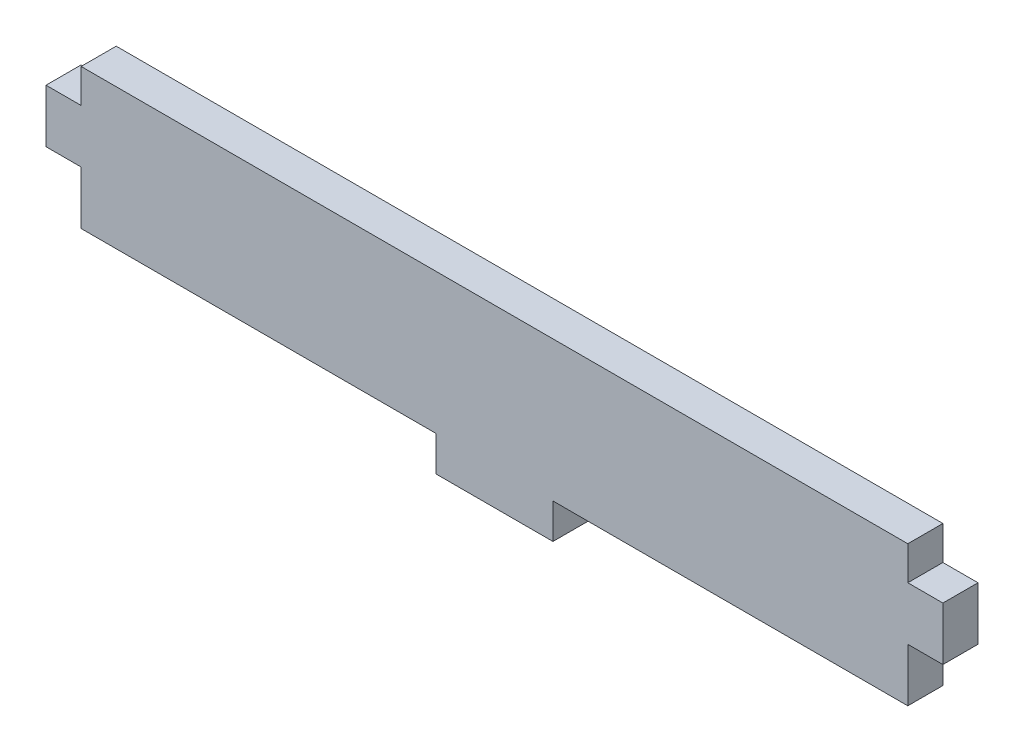
ISO-10303-21;
HEADER;
FILE_DESCRIPTION(('STEP AP214'),'2;1');
FILE_NAME('part.step','',(''),(''),'','','');
FILE_SCHEMA(('AUTOMOTIVE_DESIGN { 1 0 10303 214 1 1 1 1 }'));
ENDSEC;
DATA;
#1=APPLICATION_CONTEXT('core data for automotive mechanical design processes');
#2=APPLICATION_PROTOCOL_DEFINITION('international standard','automotive_design',2000,#1);
#3=PRODUCT_CONTEXT('',#1,'mechanical');
#4=PRODUCT('Part','Part','',(#3));
#5=PRODUCT_RELATED_PRODUCT_CATEGORY('part','',(#4));
#6=PRODUCT_DEFINITION_FORMATION('','',#4);
#7=PRODUCT_DEFINITION_CONTEXT('part definition',#1,'design');
#8=PRODUCT_DEFINITION('design','',#6,#7);
#9=PRODUCT_DEFINITION_SHAPE('','',#8);
#10=(LENGTH_UNIT() NAMED_UNIT(*) SI_UNIT(.MILLI.,.METRE.));
#11=(NAMED_UNIT(*) PLANE_ANGLE_UNIT() SI_UNIT($,.RADIAN.));
#12=(NAMED_UNIT(*) SI_UNIT($,.STERADIAN.) SOLID_ANGLE_UNIT());
#13=UNCERTAINTY_MEASURE_WITH_UNIT(LENGTH_MEASURE(1.E-05),#10,'distance_accuracy_value','');
#14=(GEOMETRIC_REPRESENTATION_CONTEXT(3) GLOBAL_UNCERTAINTY_ASSIGNED_CONTEXT((#13)) GLOBAL_UNIT_ASSIGNED_CONTEXT((#10,
#11,#12)) REPRESENTATION_CONTEXT('',''));
#15=CARTESIAN_POINT('',(0.,0.,0.));
#16=DIRECTION('',(0.,0.,1.));
#17=DIRECTION('',(1.,0.,0.));
#18=AXIS2_PLACEMENT_3D('',#15,#16,#17);
#19=CARTESIAN_POINT('',(0.,9.,9.));
#20=DIRECTION('',(0.,1.,0.));
#21=DIRECTION('',(-1.,0.,0.));
#22=AXIS2_PLACEMENT_3D('',#19,#20,#21);
#23=PLANE('',#22);
#24=DIRECTION('',(1.,0.,0.));
#25=VECTOR('',#24,1.);
#26=CARTESIAN_POINT('',(0.,9.,0.));
#27=LINE('',#26,#25);
#28=CARTESIAN_POINT('',(9.,9.,0.));
#29=VERTEX_POINT('',#28);
#30=CARTESIAN_POINT('',(100.,9.00000000000001,0.));
#31=VERTEX_POINT('',#30);
#32=EDGE_CURVE('E183',#29,#31,#27,.T.);
#33=ORIENTED_EDGE('',*,*,#32,.T.);
#34=DIRECTION('',(0.,0.,-1.));
#35=VECTOR('',#34,1.);
#36=CARTESIAN_POINT('',(100.,9.00000000000001,9.));
#37=LINE('',#36,#35);
#38=CARTESIAN_POINT('',(100.,9.00000000000001,9.));
#39=VERTEX_POINT('',#38);
#40=EDGE_CURVE('E11',#39,#31,#37,.T.);
#41=ORIENTED_EDGE('',*,*,#40,.F.);
#42=DIRECTION('',(1.,0.,0.));
#43=VECTOR('',#42,1.);
#44=CARTESIAN_POINT('',(0.,9.,9.));
#45=LINE('',#44,#43);
#46=CARTESIAN_POINT('',(9.,9.,9.));
#47=VERTEX_POINT('',#46);
#48=EDGE_CURVE('E266',#47,#39,#45,.T.);
#49=ORIENTED_EDGE('',*,*,#48,.F.);
#50=DIRECTION('',(0.,0.,-1.));
#51=VECTOR('',#50,1.);
#52=CARTESIAN_POINT('',(9.,9.,9.));
#53=LINE('',#52,#51);
#54=EDGE_CURVE('E217',#47,#29,#53,.T.);
#55=ORIENTED_EDGE('',*,*,#54,.T.);
#56=EDGE_LOOP('',(#33,#41,#49,#55));
#57=FACE_BOUND('',#56,.T.);
#58=ADVANCED_FACE('F39',(#57),#23,.F.);
#59=CARTESIAN_POINT('',(100.,0.,9.));
#60=DIRECTION('',(1.,0.,0.));
#61=DIRECTION('',(0.,0.,-1.));
#62=AXIS2_PLACEMENT_3D('',#59,#60,#61);
#63=PLANE('',#62);
#64=DIRECTION('',(0.,-1.,0.));
#65=VECTOR('',#64,1.);
#66=CARTESIAN_POINT('',(100.,0.,0.));
#67=LINE('',#66,#65);
#68=CARTESIAN_POINT('',(100.,0.,0.));
#69=VERTEX_POINT('',#68);
#70=EDGE_CURVE('E186',#31,#69,#67,.T.);
#71=ORIENTED_EDGE('',*,*,#70,.T.);
#72=DIRECTION('',(0.,0.,-1.));
#73=VECTOR('',#72,1.);
#74=CARTESIAN_POINT('',(100.,0.,9.));
#75=LINE('',#74,#73);
#76=CARTESIAN_POINT('',(100.,0.,9.));
#77=VERTEX_POINT('',#76);
#78=EDGE_CURVE('E48',#77,#69,#75,.T.);
#79=ORIENTED_EDGE('',*,*,#78,.F.);
#80=DIRECTION('',(0.,-1.,0.));
#81=VECTOR('',#80,1.);
#82=CARTESIAN_POINT('',(100.,0.,9.));
#83=LINE('',#82,#81);
#84=EDGE_CURVE('E122',#39,#77,#83,.T.);
#85=ORIENTED_EDGE('',*,*,#84,.F.);
#86=ORIENTED_EDGE('',*,*,#40,.T.);
#87=EDGE_LOOP('',(#71,#79,#85,#86));
#88=FACE_BOUND('',#87,.T.);
#89=ADVANCED_FACE('F41',(#88),#63,.F.);
#90=CARTESIAN_POINT('',(0.,0.,9.));
#91=DIRECTION('',(0.,1.,0.));
#92=DIRECTION('',(0.,0.,1.));
#93=AXIS2_PLACEMENT_3D('',#90,#91,#92);
#94=PLANE('',#93);
#95=DIRECTION('',(1.,0.,0.));
#96=VECTOR('',#95,1.);
#97=CARTESIAN_POINT('',(0.,0.,0.));
#98=LINE('',#97,#96);
#99=CARTESIAN_POINT('',(130.,0.,0.));
#100=VERTEX_POINT('',#99);
#101=EDGE_CURVE('E189',#69,#100,#98,.T.);
#102=ORIENTED_EDGE('',*,*,#101,.T.);
#103=DIRECTION('',(0.,0.,-1.));
#104=VECTOR('',#103,1.);
#105=CARTESIAN_POINT('',(130.,0.,9.));
#106=LINE('',#105,#104);
#107=CARTESIAN_POINT('',(130.,0.,9.));
#108=VERTEX_POINT('',#107);
#109=EDGE_CURVE('E242',#108,#100,#106,.T.);
#110=ORIENTED_EDGE('',*,*,#109,.F.);
#111=DIRECTION('',(1.,0.,0.));
#112=VECTOR('',#111,1.);
#113=CARTESIAN_POINT('',(0.,0.,9.));
#114=LINE('',#113,#112);
#115=EDGE_CURVE('E249',#77,#108,#114,.T.);
#116=ORIENTED_EDGE('',*,*,#115,.F.);
#117=ORIENTED_EDGE('',*,*,#78,.T.);
#118=EDGE_LOOP('',(#102,#110,#116,#117));
#119=FACE_BOUND('',#118,.T.);
#120=ADVANCED_FACE('F247',(#119),#94,.F.);
#121=CARTESIAN_POINT('',(130.,0.,9.));
#122=DIRECTION('',(1.,0.,0.));
#123=DIRECTION('',(0.,0.,-1.));
#124=AXIS2_PLACEMENT_3D('',#121,#122,#123);
#125=PLANE('',#124);
#126=DIRECTION('',(0.,-1.,0.));
#127=VECTOR('',#126,1.);
#128=CARTESIAN_POINT('',(130.,0.,0.));
#129=LINE('',#128,#127);
#130=CARTESIAN_POINT('',(130.,9.00000000000001,0.));
#131=VERTEX_POINT('',#130);
#132=EDGE_CURVE('E192',#131,#100,#129,.T.);
#133=ORIENTED_EDGE('',*,*,#132,.F.);
#134=DIRECTION('',(0.,0.,-1.));
#135=VECTOR('',#134,1.);
#136=CARTESIAN_POINT('',(130.,9.00000000000001,9.));
#137=LINE('',#136,#135);
#138=CARTESIAN_POINT('',(130.,9.00000000000001,9.));
#139=VERTEX_POINT('',#138);
#140=EDGE_CURVE('E240',#139,#131,#137,.T.);
#141=ORIENTED_EDGE('',*,*,#140,.F.);
#142=DIRECTION('',(0.,-1.,0.));
#143=VECTOR('',#142,1.);
#144=CARTESIAN_POINT('',(130.,0.,9.));
#145=LINE('',#144,#143);
#146=EDGE_CURVE('E261',#139,#108,#145,.T.);
#147=ORIENTED_EDGE('',*,*,#146,.T.);
#148=ORIENTED_EDGE('',*,*,#109,.T.);
#149=EDGE_LOOP('',(#133,#141,#147,#148));
#150=FACE_BOUND('',#149,.T.);
#151=ADVANCED_FACE('F257',(#150),#125,.T.);
#152=CARTESIAN_POINT('',(221.,9.00000000000002,0.));
#153=VERTEX_POINT('',#152);
#154=EDGE_CURVE('E187',#131,#153,#27,.T.);
#155=ORIENTED_EDGE('',*,*,#154,.T.);
#156=DIRECTION('',(0.,0.,-1.));
#157=VECTOR('',#156,1.);
#158=CARTESIAN_POINT('',(221.,9.00000000000002,9.));
#159=LINE('',#158,#157);
#160=CARTESIAN_POINT('',(221.,9.00000000000002,9.));
#161=VERTEX_POINT('',#160);
#162=EDGE_CURVE('E237',#161,#153,#159,.T.);
#163=ORIENTED_EDGE('',*,*,#162,.F.);
#164=EDGE_CURVE('E262',#139,#161,#45,.T.);
#165=ORIENTED_EDGE('',*,*,#164,.F.);
#166=ORIENTED_EDGE('',*,*,#140,.T.);
#167=EDGE_LOOP('',(#155,#163,#165,#166));
#168=FACE_BOUND('',#167,.T.);
#169=ADVANCED_FACE('F299',(#168),#23,.F.);
#170=CARTESIAN_POINT('',(221.,0.,9.));
#171=DIRECTION('',(-1.,0.,0.));
#172=DIRECTION('',(0.,0.,1.));
#173=AXIS2_PLACEMENT_3D('',#170,#171,#172);
#174=PLANE('',#173);
#175=DIRECTION('',(0.,1.,0.));
#176=VECTOR('',#175,1.);
#177=CARTESIAN_POINT('',(221.,0.,0.));
#178=LINE('',#177,#176);
#179=CARTESIAN_POINT('',(221.,22.6666666666667,0.));
#180=VERTEX_POINT('',#179);
#181=EDGE_CURVE('E195',#153,#180,#178,.T.);
#182=ORIENTED_EDGE('',*,*,#181,.T.);
#183=DIRECTION('',(0.,0.,-1.));
#184=VECTOR('',#183,1.);
#185=CARTESIAN_POINT('',(221.,22.6666666666667,9.));
#186=LINE('',#185,#184);
#187=CARTESIAN_POINT('',(221.,22.6666666666667,9.));
#188=VERTEX_POINT('',#187);
#189=EDGE_CURVE('E235',#188,#180,#186,.T.);
#190=ORIENTED_EDGE('',*,*,#189,.F.);
#191=DIRECTION('',(0.,1.,0.));
#192=VECTOR('',#191,1.);
#193=CARTESIAN_POINT('',(221.,0.,9.));
#194=LINE('',#193,#192);
#195=EDGE_CURVE('E264',#161,#188,#194,.T.);
#196=ORIENTED_EDGE('',*,*,#195,.F.);
#197=ORIENTED_EDGE('',*,*,#162,.T.);
#198=EDGE_LOOP('',(#182,#190,#196,#197));
#199=FACE_BOUND('',#198,.T.);
#200=ADVANCED_FACE('F305',(#199),#174,.F.);
#201=CARTESIAN_POINT('',(0.,22.6666666666667,9.));
#202=DIRECTION('',(0.,-1.,0.));
#203=DIRECTION('',(0.,0.,-1.));
#204=AXIS2_PLACEMENT_3D('',#201,#202,#203);
#205=PLANE('',#204);
#206=DIRECTION('',(-1.,0.,0.));
#207=VECTOR('',#206,1.);
#208=CARTESIAN_POINT('',(0.,22.6666666666667,0.));
#209=LINE('',#208,#207);
#210=CARTESIAN_POINT('',(230.,22.6666666666667,0.));
#211=VERTEX_POINT('',#210);
#212=EDGE_CURVE('E198',#211,#180,#209,.T.);
#213=ORIENTED_EDGE('',*,*,#212,.F.);
#214=DIRECTION('',(0.,0.,-1.));
#215=VECTOR('',#214,1.);
#216=CARTESIAN_POINT('',(230.,22.6666666666667,9.));
#217=LINE('',#216,#215);
#218=CARTESIAN_POINT('',(230.,22.6666666666667,9.));
#219=VERTEX_POINT('',#218);
#220=EDGE_CURVE('E233',#219,#211,#217,.T.);
#221=ORIENTED_EDGE('',*,*,#220,.F.);
#222=DIRECTION('',(-1.,0.,0.));
#223=VECTOR('',#222,1.);
#224=CARTESIAN_POINT('',(0.,22.6666666666667,9.));
#225=LINE('',#224,#223);
#226=EDGE_CURVE('E271',#219,#188,#225,.T.);
#227=ORIENTED_EDGE('',*,*,#226,.T.);
#228=ORIENTED_EDGE('',*,*,#189,.T.);
#229=EDGE_LOOP('',(#213,#221,#227,#228));
#230=FACE_BOUND('',#229,.T.);
#231=ADVANCED_FACE('F311',(#230),#205,.T.);
#232=CARTESIAN_POINT('',(230.,0.,9.));
#233=DIRECTION('',(-1.,0.,0.));
#234=DIRECTION('',(0.,0.,1.));
#235=AXIS2_PLACEMENT_3D('',#232,#233,#234);
#236=PLANE('',#235);
#237=DIRECTION('',(0.,1.,0.));
#238=VECTOR('',#237,1.);
#239=CARTESIAN_POINT('',(230.,0.,0.));
#240=LINE('',#239,#238);
#241=CARTESIAN_POINT('',(230.,36.3333333333333,0.));
#242=VERTEX_POINT('',#241);
#243=EDGE_CURVE('E202',#211,#242,#240,.T.);
#244=ORIENTED_EDGE('',*,*,#243,.T.);
#245=DIRECTION('',(0.,0.,-1.));
#246=VECTOR('',#245,1.);
#247=CARTESIAN_POINT('',(230.,36.3333333333333,9.));
#248=LINE('',#247,#246);
#249=CARTESIAN_POINT('',(230.,36.3333333333333,9.));
#250=VERTEX_POINT('',#249);
#251=EDGE_CURVE('E230',#250,#242,#248,.T.);
#252=ORIENTED_EDGE('',*,*,#251,.F.);
#253=DIRECTION('',(0.,1.,0.));
#254=VECTOR('',#253,1.);
#255=CARTESIAN_POINT('',(230.,0.,9.));
#256=LINE('',#255,#254);
#257=EDGE_CURVE('E275',#219,#250,#256,.T.);
#258=ORIENTED_EDGE('',*,*,#257,.F.);
#259=ORIENTED_EDGE('',*,*,#220,.T.);
#260=EDGE_LOOP('',(#244,#252,#258,#259));
#261=FACE_BOUND('',#260,.T.);
#262=ADVANCED_FACE('F328',(#261),#236,.F.);
#263=CARTESIAN_POINT('',(0.,36.3333333333333,9.));
#264=DIRECTION('',(0.,-1.,0.));
#265=DIRECTION('',(0.,0.,-1.));
#266=AXIS2_PLACEMENT_3D('',#263,#264,#265);
#267=PLANE('',#266);
#268=DIRECTION('',(-1.,0.,0.));
#269=VECTOR('',#268,1.);
#270=CARTESIAN_POINT('',(0.,36.3333333333333,0.));
#271=LINE('',#270,#269);
#272=CARTESIAN_POINT('',(221.,36.3333333333333,0.));
#273=VERTEX_POINT('',#272);
#274=EDGE_CURVE('E204',#242,#273,#271,.T.);
#275=ORIENTED_EDGE('',*,*,#274,.T.);
#276=DIRECTION('',(0.,0.,-1.));
#277=VECTOR('',#276,1.);
#278=CARTESIAN_POINT('',(221.,36.3333333333333,9.));
#279=LINE('',#278,#277);
#280=CARTESIAN_POINT('',(221.,36.3333333333333,9.));
#281=VERTEX_POINT('',#280);
#282=EDGE_CURVE('E227',#281,#273,#279,.T.);
#283=ORIENTED_EDGE('',*,*,#282,.F.);
#284=DIRECTION('',(-1.,0.,0.));
#285=VECTOR('',#284,1.);
#286=CARTESIAN_POINT('',(0.,36.3333333333333,9.));
#287=LINE('',#286,#285);
#288=EDGE_CURVE('E277',#250,#281,#287,.T.);
#289=ORIENTED_EDGE('',*,*,#288,.F.);
#290=ORIENTED_EDGE('',*,*,#251,.T.);
#291=EDGE_LOOP('',(#275,#283,#289,#290));
#292=FACE_BOUND('',#291,.T.);
#293=ADVANCED_FACE('F330',(#292),#267,.F.);
#294=CARTESIAN_POINT('',(221.,45.,0.));
#295=VERTEX_POINT('',#294);
#296=EDGE_CURVE('E199',#273,#295,#178,.T.);
#297=ORIENTED_EDGE('',*,*,#296,.T.);
#298=DIRECTION('',(0.,0.,-1.));
#299=VECTOR('',#298,1.);
#300=CARTESIAN_POINT('',(221.,45.,9.));
#301=LINE('',#300,#299);
#302=CARTESIAN_POINT('',(221.,45.,9.));
#303=VERTEX_POINT('',#302);
#304=EDGE_CURVE('E225',#303,#295,#301,.T.);
#305=ORIENTED_EDGE('',*,*,#304,.F.);
#306=EDGE_CURVE('E272',#281,#303,#194,.T.);
#307=ORIENTED_EDGE('',*,*,#306,.F.);
#308=ORIENTED_EDGE('',*,*,#282,.T.);
#309=EDGE_LOOP('',(#297,#305,#307,#308));
#310=FACE_BOUND('',#309,.T.);
#311=ADVANCED_FACE('F314',(#310),#174,.F.);
#312=CARTESIAN_POINT('',(0.,45.,9.));
#313=DIRECTION('',(0.,1.,0.));
#314=DIRECTION('',(-1.,0.,0.));
#315=AXIS2_PLACEMENT_3D('',#312,#313,#314);
#316=PLANE('',#315);
#317=DIRECTION('',(1.,0.,0.));
#318=VECTOR('',#317,1.);
#319=CARTESIAN_POINT('',(0.,45.,0.));
#320=LINE('',#319,#318);
#321=CARTESIAN_POINT('',(9.,45.,0.));
#322=VERTEX_POINT('',#321);
#323=EDGE_CURVE('E206',#322,#295,#320,.T.);
#324=ORIENTED_EDGE('',*,*,#323,.F.);
#325=DIRECTION('',(0.,0.,-1.));
#326=VECTOR('',#325,1.);
#327=CARTESIAN_POINT('',(9.,45.,9.));
#328=LINE('',#327,#326);
#329=CARTESIAN_POINT('',(9.,45.,9.));
#330=VERTEX_POINT('',#329);
#331=EDGE_CURVE('E223',#330,#322,#328,.T.);
#332=ORIENTED_EDGE('',*,*,#331,.F.);
#333=DIRECTION('',(1.,0.,0.));
#334=VECTOR('',#333,1.);
#335=CARTESIAN_POINT('',(0.,45.,9.));
#336=LINE('',#335,#334);
#337=EDGE_CURVE('E279',#330,#303,#336,.T.);
#338=ORIENTED_EDGE('',*,*,#337,.T.);
#339=ORIENTED_EDGE('',*,*,#304,.T.);
#340=EDGE_LOOP('',(#324,#332,#338,#339));
#341=FACE_BOUND('',#340,.T.);
#342=ADVANCED_FACE('F338',(#341),#316,.T.);
#343=CARTESIAN_POINT('',(9.,0.,9.));
#344=DIRECTION('',(1.,0.,0.));
#345=DIRECTION('',(0.,1.,0.));
#346=AXIS2_PLACEMENT_3D('',#343,#344,#345);
#347=PLANE('',#346);
#348=DIRECTION('',(0.,-1.,0.));
#349=VECTOR('',#348,1.);
#350=CARTESIAN_POINT('',(9.,0.,0.));
#351=LINE('',#350,#349);
#352=CARTESIAN_POINT('',(9.,36.3333333333333,0.));
#353=VERTEX_POINT('',#352);
#354=EDGE_CURVE('E209',#322,#353,#351,.T.);
#355=ORIENTED_EDGE('',*,*,#354,.T.);
#356=DIRECTION('',(0.,0.,-1.));
#357=VECTOR('',#356,1.);
#358=CARTESIAN_POINT('',(9.,36.3333333333333,9.));
#359=LINE('',#358,#357);
#360=CARTESIAN_POINT('',(9.,36.3333333333333,9.));
#361=VERTEX_POINT('',#360);
#362=EDGE_CURVE('E221',#361,#353,#359,.T.);
#363=ORIENTED_EDGE('',*,*,#362,.F.);
#364=DIRECTION('',(0.,-1.,0.));
#365=VECTOR('',#364,1.);
#366=CARTESIAN_POINT('',(9.,0.,9.));
#367=LINE('',#366,#365);
#368=EDGE_CURVE('E179',#330,#361,#367,.T.);
#369=ORIENTED_EDGE('',*,*,#368,.F.);
#370=ORIENTED_EDGE('',*,*,#331,.T.);
#371=EDGE_LOOP('',(#355,#363,#369,#370));
#372=FACE_BOUND('',#371,.T.);
#373=ADVANCED_FACE('F285',(#372),#347,.F.);
#374=CARTESIAN_POINT('',(0.,36.3333333333333,9.));
#375=DIRECTION('',(0.,1.,0.));
#376=DIRECTION('',(0.,0.,1.));
#377=AXIS2_PLACEMENT_3D('',#374,#375,#376);
#378=PLANE('',#377);
#379=DIRECTION('',(1.,0.,0.));
#380=VECTOR('',#379,1.);
#381=CARTESIAN_POINT('',(0.,36.3333333333333,0.));
#382=LINE('',#381,#380);
#383=CARTESIAN_POINT('',(0.,36.3333333333333,0.));
#384=VERTEX_POINT('',#383);
#385=EDGE_CURVE('E212',#384,#353,#382,.T.);
#386=ORIENTED_EDGE('',*,*,#385,.F.);
#387=DIRECTION('',(0.,0.,-1.));
#388=VECTOR('',#387,1.);
#389=CARTESIAN_POINT('',(0.,36.3333333333333,9.));
#390=LINE('',#389,#388);
#391=CARTESIAN_POINT('',(0.,36.3333333333333,9.));
#392=VERTEX_POINT('',#391);
#393=EDGE_CURVE('E168',#392,#384,#390,.T.);
#394=ORIENTED_EDGE('',*,*,#393,.F.);
#395=DIRECTION('',(1.,0.,0.));
#396=VECTOR('',#395,1.);
#397=CARTESIAN_POINT('',(0.,36.3333333333333,9.));
#398=LINE('',#397,#396);
#399=EDGE_CURVE('E177',#392,#361,#398,.T.);
#400=ORIENTED_EDGE('',*,*,#399,.T.);
#401=ORIENTED_EDGE('',*,*,#362,.T.);
#402=EDGE_LOOP('',(#386,#394,#400,#401));
#403=FACE_BOUND('',#402,.T.);
#404=ADVANCED_FACE('F289',(#403),#378,.T.);
#405=CARTESIAN_POINT('',(0.,0.,9.));
#406=DIRECTION('',(-1.,0.,0.));
#407=DIRECTION('',(0.,0.,1.));
#408=AXIS2_PLACEMENT_3D('',#405,#406,#407);
#409=PLANE('',#408);
#410=DIRECTION('',(0.,1.,0.));
#411=VECTOR('',#410,1.);
#412=CARTESIAN_POINT('',(0.,0.,0.));
#413=LINE('',#412,#411);
#414=CARTESIAN_POINT('',(0.,22.6666666666667,0.));
#415=VERTEX_POINT('',#414);
#416=EDGE_CURVE('E167',#415,#384,#413,.T.);
#417=ORIENTED_EDGE('',*,*,#416,.F.);
#418=DIRECTION('',(0.,0.,-1.));
#419=VECTOR('',#418,1.);
#420=CARTESIAN_POINT('',(0.,22.6666666666667,9.));
#421=LINE('',#420,#419);
#422=CARTESIAN_POINT('',(0.,22.6666666666667,9.));
#423=VERTEX_POINT('',#422);
#424=EDGE_CURVE('E161',#423,#415,#421,.T.);
#425=ORIENTED_EDGE('',*,*,#424,.F.);
#426=DIRECTION('',(0.,1.,0.));
#427=VECTOR('',#426,1.);
#428=CARTESIAN_POINT('',(0.,0.,9.));
#429=LINE('',#428,#427);
#430=EDGE_CURVE('E165',#423,#392,#429,.T.);
#431=ORIENTED_EDGE('',*,*,#430,.T.);
#432=ORIENTED_EDGE('',*,*,#393,.T.);
#433=EDGE_LOOP('',(#417,#425,#431,#432));
#434=FACE_BOUND('',#433,.T.);
#435=ADVANCED_FACE('F163',(#434),#409,.T.);
#436=CARTESIAN_POINT('',(0.,22.6666666666667,9.));
#437=DIRECTION('',(0.,1.,0.));
#438=DIRECTION('',(0.,0.,1.));
#439=AXIS2_PLACEMENT_3D('',#436,#437,#438);
#440=PLANE('',#439);
#441=DIRECTION('',(1.,0.,0.));
#442=VECTOR('',#441,1.);
#443=CARTESIAN_POINT('',(0.,22.6666666666667,0.));
#444=LINE('',#443,#442);
#445=CARTESIAN_POINT('',(9.,22.6666666666667,0.));
#446=VERTEX_POINT('',#445);
#447=EDGE_CURVE('E108',#415,#446,#444,.T.);
#448=ORIENTED_EDGE('',*,*,#447,.T.);
#449=DIRECTION('',(0.,0.,-1.));
#450=VECTOR('',#449,1.);
#451=CARTESIAN_POINT('',(9.,22.6666666666667,9.));
#452=LINE('',#451,#450);
#453=CARTESIAN_POINT('',(9.,22.6666666666667,9.));
#454=VERTEX_POINT('',#453);
#455=EDGE_CURVE('E169',#454,#446,#452,.T.);
#456=ORIENTED_EDGE('',*,*,#455,.F.);
#457=DIRECTION('',(1.,0.,0.));
#458=VECTOR('',#457,1.);
#459=CARTESIAN_POINT('',(0.,22.6666666666667,9.));
#460=LINE('',#459,#458);
#461=EDGE_CURVE('E171',#423,#454,#460,.T.);
#462=ORIENTED_EDGE('',*,*,#461,.F.);
#463=ORIENTED_EDGE('',*,*,#424,.T.);
#464=EDGE_LOOP('',(#448,#456,#462,#463));
#465=FACE_BOUND('',#464,.T.);
#466=ADVANCED_FACE('F172',(#465),#440,.F.);
#467=EDGE_CURVE('E114',#446,#29,#351,.T.);
#468=ORIENTED_EDGE('',*,*,#467,.T.);
#469=ORIENTED_EDGE('',*,*,#54,.F.);
#470=EDGE_CURVE('E56',#454,#47,#367,.T.);
#471=ORIENTED_EDGE('',*,*,#470,.F.);
#472=ORIENTED_EDGE('',*,*,#455,.T.);
#473=EDGE_LOOP('',(#468,#469,#471,#472));
#474=FACE_BOUND('',#473,.T.);
#475=ADVANCED_FACE('F346',(#474),#347,.F.);
#476=CARTESIAN_POINT('',(0.,0.,9.));
#477=DIRECTION('',(0.,0.,1.));
#478=DIRECTION('',(1.,0.,0.));
#479=AXIS2_PLACEMENT_3D('',#476,#477,#478);
#480=PLANE('',#479);
#481=ORIENTED_EDGE('',*,*,#48,.T.);
#482=ORIENTED_EDGE('',*,*,#84,.T.);
#483=ORIENTED_EDGE('',*,*,#115,.T.);
#484=ORIENTED_EDGE('',*,*,#146,.F.);
#485=ORIENTED_EDGE('',*,*,#164,.T.);
#486=ORIENTED_EDGE('',*,*,#195,.T.);
#487=ORIENTED_EDGE('',*,*,#226,.F.);
#488=ORIENTED_EDGE('',*,*,#257,.T.);
#489=ORIENTED_EDGE('',*,*,#288,.T.);
#490=ORIENTED_EDGE('',*,*,#306,.T.);
#491=ORIENTED_EDGE('',*,*,#337,.F.);
#492=ORIENTED_EDGE('',*,*,#368,.T.);
#493=ORIENTED_EDGE('',*,*,#399,.F.);
#494=ORIENTED_EDGE('',*,*,#430,.F.);
#495=ORIENTED_EDGE('',*,*,#461,.T.);
#496=ORIENTED_EDGE('',*,*,#470,.T.);
#497=EDGE_LOOP('',(#481,#482,#483,#484,#485,#486,#487,#488,#489,#490,#491,#492,#493,#494,#495,#496));
#498=FACE_BOUND('',#497,.T.);
#499=ADVANCED_FACE('F175',(#498),#480,.T.);
#500=CARTESIAN_POINT('',(0.,0.,0.));
#501=DIRECTION('',(0.,0.,1.));
#502=DIRECTION('',(1.,0.,0.));
#503=AXIS2_PLACEMENT_3D('',#500,#501,#502);
#504=PLANE('',#503);
#505=ORIENTED_EDGE('',*,*,#32,.F.);
#506=ORIENTED_EDGE('',*,*,#467,.F.);
#507=ORIENTED_EDGE('',*,*,#447,.F.);
#508=ORIENTED_EDGE('',*,*,#416,.T.);
#509=ORIENTED_EDGE('',*,*,#385,.T.);
#510=ORIENTED_EDGE('',*,*,#354,.F.);
#511=ORIENTED_EDGE('',*,*,#323,.T.);
#512=ORIENTED_EDGE('',*,*,#296,.F.);
#513=ORIENTED_EDGE('',*,*,#274,.F.);
#514=ORIENTED_EDGE('',*,*,#243,.F.);
#515=ORIENTED_EDGE('',*,*,#212,.T.);
#516=ORIENTED_EDGE('',*,*,#181,.F.);
#517=ORIENTED_EDGE('',*,*,#154,.F.);
#518=ORIENTED_EDGE('',*,*,#132,.T.);
#519=ORIENTED_EDGE('',*,*,#101,.F.);
#520=ORIENTED_EDGE('',*,*,#70,.F.);
#521=EDGE_LOOP('',(#505,#506,#507,#508,#509,#510,#511,#512,#513,#514,#515,#516,#517,#518,#519,#520));
#522=FACE_BOUND('',#521,.T.);
#523=ADVANCED_FACE('F252',(#522),#504,.F.);
#524=CLOSED_SHELL('',(#58,#89,#120,#151,#169,#200,#231,#262,#293,#311,#342,#373,#404,#435,#466,
#475,#499,#523));
#525=MANIFOLD_SOLID_BREP('B2',#524);
#526=ADVANCED_BREP_SHAPE_REPRESENTATION('',(#18,#525),#14);
#527=SHAPE_DEFINITION_REPRESENTATION(#9,#526);
ENDSEC;
END-ISO-10303-21;
